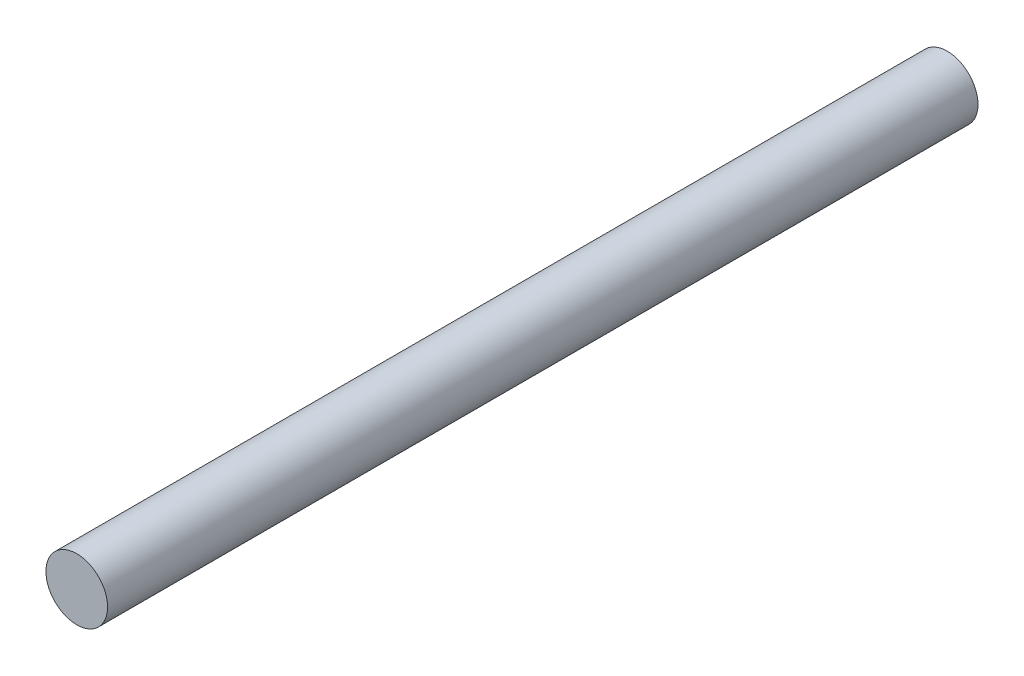
ISO-10303-21;
HEADER;
FILE_DESCRIPTION(('STEP AP214'),'2;1');
FILE_NAME('part.step','',(''),(''),'','','');
FILE_SCHEMA(('AUTOMOTIVE_DESIGN { 1 0 10303 214 1 1 1 1 }'));
ENDSEC;
DATA;
#1=APPLICATION_CONTEXT('core data for automotive mechanical design processes');
#2=APPLICATION_PROTOCOL_DEFINITION('international standard','automotive_design',2000,#1);
#3=PRODUCT_CONTEXT('',#1,'mechanical');
#4=PRODUCT('Part','Part','',(#3));
#5=PRODUCT_RELATED_PRODUCT_CATEGORY('part','',(#4));
#6=PRODUCT_DEFINITION_FORMATION('','',#4);
#7=PRODUCT_DEFINITION_CONTEXT('part definition',#1,'design');
#8=PRODUCT_DEFINITION('design','',#6,#7);
#9=PRODUCT_DEFINITION_SHAPE('','',#8);
#10=(LENGTH_UNIT() NAMED_UNIT(*) SI_UNIT(.MILLI.,.METRE.));
#11=(NAMED_UNIT(*) PLANE_ANGLE_UNIT() SI_UNIT($,.RADIAN.));
#12=(NAMED_UNIT(*) SI_UNIT($,.STERADIAN.) SOLID_ANGLE_UNIT());
#13=UNCERTAINTY_MEASURE_WITH_UNIT(LENGTH_MEASURE(1.E-05),#10,'distance_accuracy_value','');
#14=(GEOMETRIC_REPRESENTATION_CONTEXT(3) GLOBAL_UNCERTAINTY_ASSIGNED_CONTEXT((#13)) GLOBAL_UNIT_ASSIGNED_CONTEXT((#10,
#11,#12)) REPRESENTATION_CONTEXT('',''));
#15=CARTESIAN_POINT('',(0.,0.,0.));
#16=DIRECTION('',(0.,0.,1.));
#17=DIRECTION('',(1.,0.,0.));
#18=AXIS2_PLACEMENT_3D('',#15,#16,#17);
#19=CARTESIAN_POINT('',(0.,0.,56.5));
#20=DIRECTION('',(0.,0.,-1.));
#21=DIRECTION('',(-1.,0.,0.));
#22=AXIS2_PLACEMENT_3D('',#19,#20,#21);
#23=CYLINDRICAL_SURFACE('',#22,4.);
#24=CARTESIAN_POINT('',(0.,0.,56.5));
#25=DIRECTION('',(0.,0.,1.));
#26=DIRECTION('',(1.,0.,0.));
#27=AXIS2_PLACEMENT_3D('',#24,#25,#26);
#28=CIRCLE('',#27,4.);
#29=CARTESIAN_POINT('',(4.,0.,56.5));
#30=VERTEX_POINT('',#29);
#31=EDGE_CURVE('E10',#30,#30,#28,.T.);
#32=ORIENTED_EDGE('',*,*,#31,.F.);
#33=EDGE_LOOP('',(#32));
#34=FACE_BOUND('',#33,.T.);
#35=CARTESIAN_POINT('',(0.,0.,-56.5));
#36=DIRECTION('',(0.,0.,1.));
#37=DIRECTION('',(1.,0.,0.));
#38=AXIS2_PLACEMENT_3D('',#35,#36,#37);
#39=CIRCLE('',#38,4.);
#40=CARTESIAN_POINT('',(4.,0.,-56.5));
#41=VERTEX_POINT('',#40);
#42=EDGE_CURVE('E46',#41,#41,#39,.T.);
#43=ORIENTED_EDGE('',*,*,#42,.T.);
#44=EDGE_LOOP('',(#43));
#45=FACE_BOUND('',#44,.T.);
#46=ADVANCED_FACE('F43',(#34,#45),#23,.T.);
#47=CARTESIAN_POINT('',(0.,0.,56.5));
#48=DIRECTION('',(0.,0.,1.));
#49=DIRECTION('',(1.,0.,0.));
#50=AXIS2_PLACEMENT_3D('',#47,#48,#49);
#51=PLANE('',#50);
#52=ORIENTED_EDGE('',*,*,#31,.T.);
#53=EDGE_LOOP('',(#52));
#54=FACE_BOUND('',#53,.T.);
#55=ADVANCED_FACE('F58',(#54),#51,.T.);
#56=CARTESIAN_POINT('',(0.,0.,-56.5));
#57=DIRECTION('',(0.,0.,1.));
#58=DIRECTION('',(1.,0.,0.));
#59=AXIS2_PLACEMENT_3D('',#56,#57,#58);
#60=PLANE('',#59);
#61=ORIENTED_EDGE('',*,*,#42,.F.);
#62=EDGE_LOOP('',(#61));
#63=FACE_BOUND('',#62,.T.);
#64=ADVANCED_FACE('F59',(#63),#60,.F.);
#65=CLOSED_SHELL('',(#46,#55,#64));
#66=MANIFOLD_SOLID_BREP('B2',#65);
#67=ADVANCED_BREP_SHAPE_REPRESENTATION('',(#18,#66),#14);
#68=SHAPE_DEFINITION_REPRESENTATION(#9,#67);
ENDSEC;
END-ISO-10303-21;
